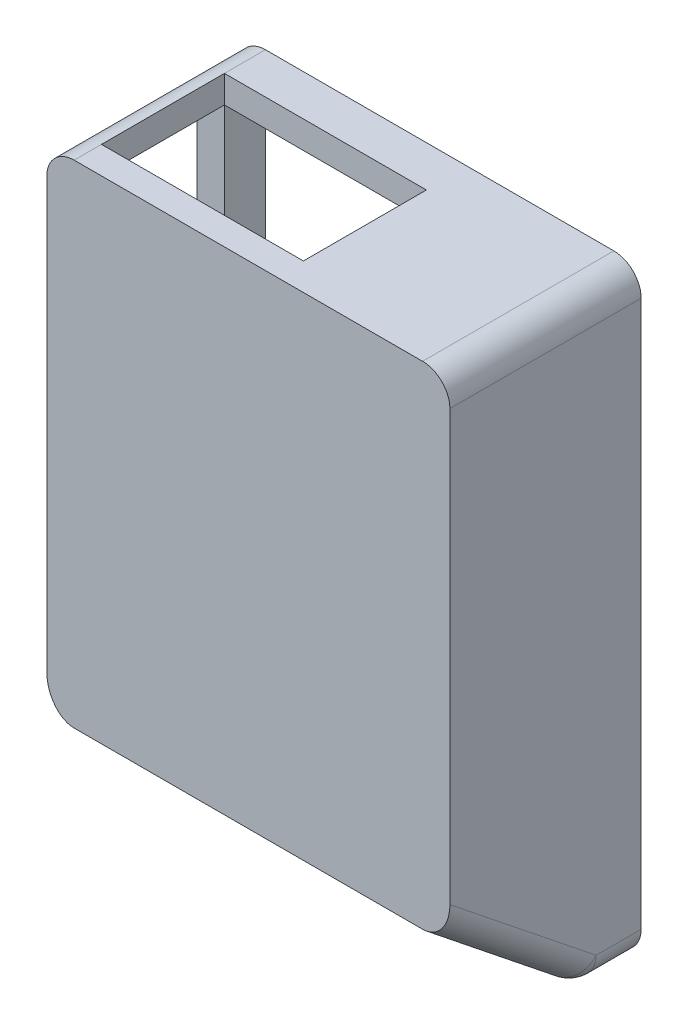
ISO-10303-21;
HEADER;
FILE_DESCRIPTION(('STEP AP214'),'2;1');
FILE_NAME('part.step','',(''),(''),'','','');
FILE_SCHEMA(('AUTOMOTIVE_DESIGN { 1 0 10303 214 1 1 1 1 }'));
ENDSEC;
DATA;
#1=APPLICATION_CONTEXT('core data for automotive mechanical design processes');
#2=APPLICATION_PROTOCOL_DEFINITION('international standard','automotive_design',2000,#1);
#3=PRODUCT_CONTEXT('',#1,'mechanical');
#4=PRODUCT('Part','Part','',(#3));
#5=PRODUCT_RELATED_PRODUCT_CATEGORY('part','',(#4));
#6=PRODUCT_DEFINITION_FORMATION('','',#4);
#7=PRODUCT_DEFINITION_CONTEXT('part definition',#1,'design');
#8=PRODUCT_DEFINITION('design','',#6,#7);
#9=PRODUCT_DEFINITION_SHAPE('','',#8);
#10=(LENGTH_UNIT() NAMED_UNIT(*) SI_UNIT(.MILLI.,.METRE.));
#11=(NAMED_UNIT(*) PLANE_ANGLE_UNIT() SI_UNIT($,.RADIAN.));
#12=(NAMED_UNIT(*) SI_UNIT($,.STERADIAN.) SOLID_ANGLE_UNIT());
#13=UNCERTAINTY_MEASURE_WITH_UNIT(LENGTH_MEASURE(1.E-05),#10,'distance_accuracy_value','');
#14=(GEOMETRIC_REPRESENTATION_CONTEXT(3) GLOBAL_UNCERTAINTY_ASSIGNED_CONTEXT((#13)) GLOBAL_UNIT_ASSIGNED_CONTEXT((#10,
#11,#12)) REPRESENTATION_CONTEXT('',''));
#15=CARTESIAN_POINT('',(0.,0.,0.));
#16=DIRECTION('',(0.,0.,1.));
#17=DIRECTION('',(1.,0.,0.));
#18=AXIS2_PLACEMENT_3D('',#15,#16,#17);
#19=CARTESIAN_POINT('',(-12.75,-20.,12.));
#20=DIRECTION('',(1.,0.,0.));
#21=DIRECTION('',(0.,0.,-1.));
#22=AXIS2_PLACEMENT_3D('',#19,#20,#21);
#23=PLANE('',#22);
#24=DIRECTION('',(0.,0.,-1.));
#25=VECTOR('',#24,1.);
#26=CARTESIAN_POINT('',(-12.75,20.,12.));
#27=LINE('',#26,#25);
#28=CARTESIAN_POINT('',(-12.75,20.,12.));
#29=VERTEX_POINT('',#28);
#30=CARTESIAN_POINT('',(-12.75,20.,3.));
#31=VERTEX_POINT('',#30);
#32=EDGE_CURVE('E256',#29,#31,#27,.T.);
#33=ORIENTED_EDGE('',*,*,#32,.T.);
#34=DIRECTION('',(0.,1.,0.));
#35=VECTOR('',#34,1.);
#36=CARTESIAN_POINT('',(-12.75,-22.001,3.));
#37=LINE('',#36,#35);
#38=CARTESIAN_POINT('',(-12.75,22.,3.));
#39=VERTEX_POINT('',#38);
#40=EDGE_CURVE('E268',#31,#39,#37,.T.);
#41=ORIENTED_EDGE('',*,*,#40,.T.);
#42=DIRECTION('',(0.,0.,1.));
#43=VECTOR('',#42,1.);
#44=CARTESIAN_POINT('',(-12.75,22.,3.));
#45=LINE('',#44,#43);
#46=CARTESIAN_POINT('',(-12.75,22.,12.));
#47=VERTEX_POINT('',#46);
#48=EDGE_CURVE('E905',#39,#47,#45,.T.);
#49=ORIENTED_EDGE('',*,*,#48,.T.);
#50=DIRECTION('',(0.,-1.,0.));
#51=VECTOR('',#50,1.);
#52=CARTESIAN_POINT('',(-12.75,-20.,12.));
#53=LINE('',#52,#51);
#54=EDGE_CURVE('E267',#47,#29,#53,.T.);
#55=ORIENTED_EDGE('',*,*,#54,.T.);
#56=EDGE_LOOP('',(#33,#41,#49,#55));
#57=FACE_BOUND('',#56,.T.);
#58=ADVANCED_FACE('F51',(#57),#23,.T.);
#59=CARTESIAN_POINT('',(12.75,-20.,12.));
#60=DIRECTION('',(-1.,0.,0.));
#61=DIRECTION('',(0.,0.,1.));
#62=AXIS2_PLACEMENT_3D('',#59,#60,#61);
#63=PLANE('',#62);
#64=DIRECTION('',(0.,0.,-1.));
#65=VECTOR('',#64,1.);
#66=CARTESIAN_POINT('',(12.75,-20.,12.));
#67=LINE('',#66,#65);
#68=CARTESIAN_POINT('',(12.75,-20.,2.));
#69=VERTEX_POINT('',#68);
#70=CARTESIAN_POINT('',(12.75,-20.,0.));
#71=VERTEX_POINT('',#70);
#72=EDGE_CURVE('E297',#69,#71,#67,.T.);
#73=ORIENTED_EDGE('',*,*,#72,.F.);
#74=DIRECTION('',(0.,0.624695047554424,0.78086880944303));
#75=VECTOR('',#74,1.);
#76=CARTESIAN_POINT('',(12.75,-15.1219512195122,8.09756097560976));
#77=LINE('',#76,#75);
#78=CARTESIAN_POINT('',(12.75,-12.,12.));
#79=VERTEX_POINT('',#78);
#80=EDGE_CURVE('E352',#69,#79,#77,.T.);
#81=ORIENTED_EDGE('',*,*,#80,.T.);
#82=DIRECTION('',(0.,1.,0.));
#83=VECTOR('',#82,1.);
#84=CARTESIAN_POINT('',(12.75,-20.,12.));
#85=LINE('',#84,#83);
#86=CARTESIAN_POINT('',(12.75,-4.05188691446148,12.));
#87=VERTEX_POINT('',#86);
#88=EDGE_CURVE('E303',#79,#87,#85,.T.);
#89=ORIENTED_EDGE('',*,*,#88,.T.);
#90=DIRECTION('',(0.,0.,1.));
#91=VECTOR('',#90,1.);
#92=CARTESIAN_POINT('',(12.7499999999967,-4.05188691446148,-26.3329647750023));
#93=LINE('',#92,#91);
#94=CARTESIAN_POINT('',(12.75,-4.05188691446147,1.6));
#95=VERTEX_POINT('',#94);
#96=EDGE_CURVE('E871',#95,#87,#93,.T.);
#97=ORIENTED_EDGE('',*,*,#96,.F.);
#98=DIRECTION('',(0.,-1.,0.));
#99=VECTOR('',#98,1.);
#100=CARTESIAN_POINT('',(12.7499999999967,4.68218043449235,1.6));
#101=LINE('',#100,#99);
#102=CARTESIAN_POINT('',(12.75,4.68218043449235,1.6));
#103=VERTEX_POINT('',#102);
#104=EDGE_CURVE('E826',#103,#95,#101,.T.);
#105=ORIENTED_EDGE('',*,*,#104,.F.);
#106=DIRECTION('',(0.,0.,1.));
#107=VECTOR('',#106,1.);
#108=CARTESIAN_POINT('',(12.7499999999967,4.68218043449235,-26.3329647750023));
#109=LINE('',#108,#107);
#110=CARTESIAN_POINT('',(12.75,4.68218043449235,12.));
#111=VERTEX_POINT('',#110);
#112=EDGE_CURVE('E875',#103,#111,#109,.T.);
#113=ORIENTED_EDGE('',*,*,#112,.T.);
#114=CARTESIAN_POINT('',(12.75,20.,12.));
#115=VERTEX_POINT('',#114);
#116=EDGE_CURVE('E832',#111,#115,#85,.T.);
#117=ORIENTED_EDGE('',*,*,#116,.T.);
#118=DIRECTION('',(0.,0.,-1.));
#119=VECTOR('',#118,1.);
#120=CARTESIAN_POINT('',(12.75,20.,12.));
#121=LINE('',#120,#119);
#122=CARTESIAN_POINT('',(12.75,20.,0.));
#123=VERTEX_POINT('',#122);
#124=EDGE_CURVE('E300',#115,#123,#121,.T.);
#125=ORIENTED_EDGE('',*,*,#124,.T.);
#126=DIRECTION('',(0.,1.,0.));
#127=VECTOR('',#126,1.);
#128=CARTESIAN_POINT('',(12.75,-20.,0.));
#129=LINE('',#128,#127);
#130=EDGE_CURVE('E836',#71,#123,#129,.T.);
#131=ORIENTED_EDGE('',*,*,#130,.F.);
#132=EDGE_LOOP('',(#73,#81,#89,#97,#105,#113,#117,#125,#131));
#133=FACE_BOUND('',#132,.T.);
#134=ADVANCED_FACE('F473',(#133),#63,.T.);
#135=CARTESIAN_POINT('',(12.75,20.,12.));
#136=DIRECTION('',(0.,-1.,0.));
#137=DIRECTION('',(1.,0.,0.));
#138=AXIS2_PLACEMENT_3D('',#135,#136,#137);
#139=PLANE('',#138);
#140=DIRECTION('',(-1.,0.,0.));
#141=VECTOR('',#140,1.);
#142=CARTESIAN_POINT('',(-12.75,20.,3.));
#143=LINE('',#142,#141);
#144=CARTESIAN_POINT('',(2.02937643160162,20.000000000005,3.));
#145=VERTEX_POINT('',#144);
#146=EDGE_CURVE('E273',#145,#31,#143,.T.);
#147=ORIENTED_EDGE('',*,*,#146,.T.);
#148=DIRECTION('',(0.,0.,-1.));
#149=VECTOR('',#148,1.);
#150=CARTESIAN_POINT('',(-12.75,20.,12.));
#151=LINE('',#150,#149);
#152=CARTESIAN_POINT('',(-12.75,20.,0.));
#153=VERTEX_POINT('',#152);
#154=EDGE_CURVE('E282',#31,#153,#151,.T.);
#155=ORIENTED_EDGE('',*,*,#154,.T.);
#156=DIRECTION('',(-1.,0.,0.));
#157=VECTOR('',#156,1.);
#158=CARTESIAN_POINT('',(12.75,20.,0.));
#159=LINE('',#158,#157);
#160=EDGE_CURVE('E306',#123,#153,#159,.T.);
#161=ORIENTED_EDGE('',*,*,#160,.F.);
#162=ORIENTED_EDGE('',*,*,#124,.F.);
#163=DIRECTION('',(-1.,0.,0.));
#164=VECTOR('',#163,1.);
#165=CARTESIAN_POINT('',(12.75,20.,12.));
#166=LINE('',#165,#164);
#167=CARTESIAN_POINT('',(4.02937643160162,20.,12.));
#168=VERTEX_POINT('',#167);
#169=EDGE_CURVE('E296',#115,#168,#166,.T.);
#170=ORIENTED_EDGE('',*,*,#169,.T.);
#171=DIRECTION('',(0.,0.,1.));
#172=VECTOR('',#171,1.);
#173=CARTESIAN_POINT('',(4.02937643160162,20.000000000005,-26.3329647750023));
#174=LINE('',#173,#172);
#175=CARTESIAN_POINT('',(4.02937643160162,20.,1.6));
#176=VERTEX_POINT('',#175);
#177=EDGE_CURVE('E857',#176,#168,#174,.T.);
#178=ORIENTED_EDGE('',*,*,#177,.F.);
#179=DIRECTION('',(1.,0.,0.));
#180=VECTOR('',#179,1.);
#181=CARTESIAN_POINT('',(2.02937643160162,20.000000000005,1.6));
#182=LINE('',#181,#180);
#183=CARTESIAN_POINT('',(2.02937643160162,20.,1.6));
#184=VERTEX_POINT('',#183);
#185=EDGE_CURVE('E892',#184,#176,#182,.T.);
#186=ORIENTED_EDGE('',*,*,#185,.F.);
#187=DIRECTION('',(0.,0.,1.));
#188=VECTOR('',#187,1.);
#189=CARTESIAN_POINT('',(2.02937643160162,20.000000000005,-26.3329647750023));
#190=LINE('',#189,#188);
#191=EDGE_CURVE('E290',#184,#145,#190,.T.);
#192=ORIENTED_EDGE('',*,*,#191,.T.);
#193=EDGE_LOOP('',(#147,#155,#161,#162,#170,#178,#186,#192));
#194=FACE_BOUND('',#193,.T.);
#195=ADVANCED_FACE('F281',(#194),#139,.T.);
#196=CARTESIAN_POINT('',(0.,0.,12.));
#197=DIRECTION('',(0.,0.,1.));
#198=DIRECTION('',(1.,0.,0.));
#199=AXIS2_PLACEMENT_3D('',#196,#197,#198);
#200=PLANE('',#199);
#201=DIRECTION('',(0.,-1.,0.));
#202=VECTOR('',#201,1.);
#203=CARTESIAN_POINT('',(4.02937643160162,20.000000000005,12.));
#204=LINE('',#203,#202);
#205=CARTESIAN_POINT('',(4.02937643160162,4.68218043449235,12.));
#206=VERTEX_POINT('',#205);
#207=EDGE_CURVE('E858',#168,#206,#204,.T.);
#208=ORIENTED_EDGE('',*,*,#207,.F.);
#209=ORIENTED_EDGE('',*,*,#169,.F.);
#210=ORIENTED_EDGE('',*,*,#116,.F.);
#211=DIRECTION('',(1.,0.,0.));
#212=VECTOR('',#211,1.);
#213=CARTESIAN_POINT('',(4.02937643160162,4.68218043449235,12.));
#214=LINE('',#213,#212);
#215=EDGE_CURVE('E872',#206,#111,#214,.T.);
#216=ORIENTED_EDGE('',*,*,#215,.F.);
#217=EDGE_LOOP('',(#208,#209,#210,#216));
#218=FACE_BOUND('',#217,.T.);
#219=ADVANCED_FACE('F712',(#218),#200,.F.);
#220=ORIENTED_EDGE('',*,*,#88,.F.);
#221=DIRECTION('',(-1.,0.,0.));
#222=VECTOR('',#221,1.);
#223=CARTESIAN_POINT('',(0.,-12.,12.));
#224=LINE('',#223,#222);
#225=CARTESIAN_POINT('',(-12.75,-12.,12.));
#226=VERTEX_POINT('',#225);
#227=EDGE_CURVE('E351',#79,#226,#224,.T.);
#228=ORIENTED_EDGE('',*,*,#227,.T.);
#229=CARTESIAN_POINT('',(-12.75,9.53218327183042,12.));
#230=VERTEX_POINT('',#229);
#231=EDGE_CURVE('E833',#230,#226,#53,.T.);
#232=ORIENTED_EDGE('',*,*,#231,.F.);
#233=DIRECTION('',(-1.,0.,0.));
#234=VECTOR('',#233,1.);
#235=CARTESIAN_POINT('',(14.751,9.53218327183042,12.));
#236=LINE('',#235,#234);
#237=CARTESIAN_POINT('',(-14.75,9.53218327183042,12.));
#238=VERTEX_POINT('',#237);
#239=EDGE_CURVE('E907',#230,#238,#236,.T.);
#240=ORIENTED_EDGE('',*,*,#239,.T.);
#241=DIRECTION('',(0.,1.,0.));
#242=VECTOR('',#241,1.);
#243=CARTESIAN_POINT('',(-14.75,20.,12.));
#244=LINE('',#243,#242);
#245=CARTESIAN_POINT('',(-14.75,20.,12.));
#246=VERTEX_POINT('',#245);
#247=EDGE_CURVE('E912',#238,#246,#244,.T.);
#248=ORIENTED_EDGE('',*,*,#247,.T.);
#249=DIRECTION('',(-1.,0.,0.));
#250=VECTOR('',#249,1.);
#251=CARTESIAN_POINT('',(14.751,20.,12.));
#252=LINE('',#251,#250);
#253=EDGE_CURVE('E286',#29,#246,#252,.T.);
#254=ORIENTED_EDGE('',*,*,#253,.F.);
#255=ORIENTED_EDGE('',*,*,#54,.F.);
#256=DIRECTION('',(1.,0.,0.));
#257=VECTOR('',#256,1.);
#258=CARTESIAN_POINT('',(-12.75,22.,12.));
#259=LINE('',#258,#257);
#260=CARTESIAN_POINT('',(2.02937643160162,22.,12.));
#261=VERTEX_POINT('',#260);
#262=EDGE_CURVE('E904',#47,#261,#259,.T.);
#263=ORIENTED_EDGE('',*,*,#262,.T.);
#264=DIRECTION('',(0.,1.,0.));
#265=VECTOR('',#264,1.);
#266=CARTESIAN_POINT('',(2.02937643160162,-4.05188691446148,12.));
#267=LINE('',#266,#265);
#268=CARTESIAN_POINT('',(2.02937643160162,0.948113085538524,12.));
#269=VERTEX_POINT('',#268);
#270=EDGE_CURVE('E879',#269,#261,#267,.T.);
#271=ORIENTED_EDGE('',*,*,#270,.F.);
#272=CARTESIAN_POINT('',(7.02937643160162,0.948113085538524,12.));
#273=DIRECTION('',(0.,0.,1.));
#274=DIRECTION('',(1.,0.,0.));
#275=AXIS2_PLACEMENT_3D('',#272,#273,#274);
#276=CIRCLE('',#275,5.);
#277=CARTESIAN_POINT('',(7.02937643160162,-4.05188691446148,12.));
#278=VERTEX_POINT('',#277);
#279=EDGE_CURVE('E366',#269,#278,#276,.T.);
#280=ORIENTED_EDGE('',*,*,#279,.T.);
#281=DIRECTION('',(-1.,0.,0.));
#282=VECTOR('',#281,1.);
#283=CARTESIAN_POINT('',(12.7499999999967,-4.05188691446148,12.));
#284=LINE('',#283,#282);
#285=EDGE_CURVE('E877',#87,#278,#284,.T.);
#286=ORIENTED_EDGE('',*,*,#285,.F.);
#287=EDGE_LOOP('',(#220,#228,#232,#240,#248,#254,#255,#263,#271,#280,#286));
#288=FACE_BOUND('',#287,.T.);
#289=ADVANCED_FACE('F725',(#288),#200,.F.);
#290=CARTESIAN_POINT('',(0.,0.,0.));
#291=DIRECTION('',(0.,0.,-1.));
#292=DIRECTION('',(-1.,0.,0.));
#293=AXIS2_PLACEMENT_3D('',#290,#291,#292);
#294=PLANE('',#293);
#295=DIRECTION('',(0.,1.,0.));
#296=VECTOR('',#295,1.);
#297=CARTESIAN_POINT('',(14.75,-22.,0.));
#298=LINE('',#297,#296);
#299=CARTESIAN_POINT('',(14.75,-20.,0.));
#300=VERTEX_POINT('',#299);
#301=CARTESIAN_POINT('',(14.75,20.,0.));
#302=VERTEX_POINT('',#301);
#303=EDGE_CURVE('E313',#300,#302,#298,.T.);
#304=ORIENTED_EDGE('',*,*,#303,.F.);
#305=CARTESIAN_POINT('',(12.75,-20.,0.));
#306=DIRECTION('',(0.,0.,-1.));
#307=DIRECTION('',(-1.,0.,0.));
#308=AXIS2_PLACEMENT_3D('',#305,#306,#307);
#309=CIRCLE('',#308,2.);
#310=CARTESIAN_POINT('',(12.75,-22.,0.));
#311=VERTEX_POINT('',#310);
#312=EDGE_CURVE('E66',#300,#311,#309,.T.);
#313=ORIENTED_EDGE('',*,*,#312,.T.);
#314=DIRECTION('',(1.,0.,0.));
#315=VECTOR('',#314,1.);
#316=CARTESIAN_POINT('',(14.75,-22.,0.));
#317=LINE('',#316,#315);
#318=CARTESIAN_POINT('',(-12.75,-22.,0.));
#319=VERTEX_POINT('',#318);
#320=EDGE_CURVE('E315',#319,#311,#317,.T.);
#321=ORIENTED_EDGE('',*,*,#320,.F.);
#322=CARTESIAN_POINT('',(-12.75,-20.,0.));
#323=DIRECTION('',(0.,0.,-1.));
#324=DIRECTION('',(-1.,0.,0.));
#325=AXIS2_PLACEMENT_3D('',#322,#323,#324);
#326=CIRCLE('',#325,2.);
#327=CARTESIAN_POINT('',(-14.75,-20.,0.));
#328=VERTEX_POINT('',#327);
#329=EDGE_CURVE('E392',#319,#328,#326,.T.);
#330=ORIENTED_EDGE('',*,*,#329,.T.);
#331=DIRECTION('',(0.,-1.,0.));
#332=VECTOR('',#331,1.);
#333=CARTESIAN_POINT('',(-14.75,-22.,0.));
#334=LINE('',#333,#332);
#335=CARTESIAN_POINT('',(-14.75,20.,0.));
#336=VERTEX_POINT('',#335);
#337=EDGE_CURVE('E316',#336,#328,#334,.T.);
#338=ORIENTED_EDGE('',*,*,#337,.F.);
#339=CARTESIAN_POINT('',(-12.75,20.,0.));
#340=DIRECTION('',(0.,0.,-1.));
#341=DIRECTION('',(-1.,0.,0.));
#342=AXIS2_PLACEMENT_3D('',#339,#340,#341);
#343=CIRCLE('',#342,2.);
#344=CARTESIAN_POINT('',(-12.75,22.,0.));
#345=VERTEX_POINT('',#344);
#346=EDGE_CURVE('E329',#336,#345,#343,.T.);
#347=ORIENTED_EDGE('',*,*,#346,.T.);
#348=DIRECTION('',(-1.,0.,0.));
#349=VECTOR('',#348,1.);
#350=CARTESIAN_POINT('',(14.75,22.,0.));
#351=LINE('',#350,#349);
#352=CARTESIAN_POINT('',(12.75,22.,0.));
#353=VERTEX_POINT('',#352);
#354=EDGE_CURVE('E317',#353,#345,#351,.T.);
#355=ORIENTED_EDGE('',*,*,#354,.F.);
#356=CARTESIAN_POINT('',(12.75,20.,0.));
#357=DIRECTION('',(0.,0.,-1.));
#358=DIRECTION('',(-1.,0.,0.));
#359=AXIS2_PLACEMENT_3D('',#356,#357,#358);
#360=CIRCLE('',#359,2.);
#361=EDGE_CURVE('E333',#353,#302,#360,.T.);
#362=ORIENTED_EDGE('',*,*,#361,.T.);
#363=EDGE_LOOP('',(#304,#313,#321,#330,#338,#347,#355,#362));
#364=FACE_BOUND('',#363,.T.);
#365=ORIENTED_EDGE('',*,*,#160,.T.);
#366=DIRECTION('',(0.,-1.,0.));
#367=VECTOR('',#366,1.);
#368=CARTESIAN_POINT('',(-12.75,-20.,0.));
#369=LINE('',#368,#367);
#370=CARTESIAN_POINT('',(-12.75,-20.,0.));
#371=VERTEX_POINT('',#370);
#372=EDGE_CURVE('E294',#153,#371,#369,.T.);
#373=ORIENTED_EDGE('',*,*,#372,.T.);
#374=DIRECTION('',(1.,0.,0.));
#375=VECTOR('',#374,1.);
#376=CARTESIAN_POINT('',(12.75,-20.,0.));
#377=LINE('',#376,#375);
#378=EDGE_CURVE('E840',#371,#71,#377,.T.);
#379=ORIENTED_EDGE('',*,*,#378,.T.);
#380=ORIENTED_EDGE('',*,*,#130,.T.);
#381=EDGE_LOOP('',(#365,#373,#379,#380));
#382=FACE_BOUND('',#381,.T.);
#383=ADVANCED_FACE('F420',(#364,#382),#294,.T.);
#384=CARTESIAN_POINT('',(14.75,-22.,12.));
#385=DIRECTION('',(0.,1.,0.));
#386=DIRECTION('',(-1.,0.,0.));
#387=AXIS2_PLACEMENT_3D('',#384,#385,#386);
#388=PLANE('',#387);
#389=ORIENTED_EDGE('',*,*,#320,.T.);
#390=DIRECTION('',(0.,0.,-1.));
#391=VECTOR('',#390,1.);
#392=CARTESIAN_POINT('',(12.75,-22.,12.));
#393=LINE('',#392,#391);
#394=CARTESIAN_POINT('',(12.75,-22.,3.29843788128358));
#395=VERTEX_POINT('',#394);
#396=EDGE_CURVE('E14',#311,#395,#393,.F.);
#397=ORIENTED_EDGE('',*,*,#396,.T.);
#398=DIRECTION('',(-1.,0.,0.));
#399=VECTOR('',#398,1.);
#400=CARTESIAN_POINT('',(-14.75,-22.,3.29843788128358));
#401=LINE('',#400,#399);
#402=CARTESIAN_POINT('',(-12.75,-22.,3.29843788128358));
#403=VERTEX_POINT('',#402);
#404=EDGE_CURVE('E368',#395,#403,#401,.T.);
#405=ORIENTED_EDGE('',*,*,#404,.T.);
#406=DIRECTION('',(0.,0.,-1.));
#407=VECTOR('',#406,1.);
#408=CARTESIAN_POINT('',(-12.75,-22.,12.));
#409=LINE('',#408,#407);
#410=EDGE_CURVE('E58',#403,#319,#409,.T.);
#411=ORIENTED_EDGE('',*,*,#410,.T.);
#412=EDGE_LOOP('',(#389,#397,#405,#411));
#413=FACE_BOUND('',#412,.T.);
#414=ADVANCED_FACE('F448',(#413),#388,.F.);
#415=CARTESIAN_POINT('',(14.75,-22.,12.));
#416=DIRECTION('',(-1.,0.,0.));
#417=DIRECTION('',(0.,0.,1.));
#418=AXIS2_PLACEMENT_3D('',#415,#416,#417);
#419=PLANE('',#418);
#420=DIRECTION('',(0.,1.,0.));
#421=VECTOR('',#420,1.);
#422=CARTESIAN_POINT('',(14.75,0.,14.));
#423=LINE('',#422,#421);
#424=CARTESIAN_POINT('',(14.75,-11.4387503050269,14.));
#425=VERTEX_POINT('',#424);
#426=CARTESIAN_POINT('',(14.75,20.,14.));
#427=VERTEX_POINT('',#426);
#428=EDGE_CURVE('E823',#425,#427,#423,.T.);
#429=ORIENTED_EDGE('',*,*,#428,.F.);
#430=DIRECTION('',(0.,-0.624695047554424,-0.78086880944303));
#431=VECTOR('',#430,1.);
#432=CARTESIAN_POINT('',(14.75,-20.,3.29843788128358));
#433=LINE('',#432,#431);
#434=CARTESIAN_POINT('',(14.75,-20.,3.29843788128358));
#435=VERTEX_POINT('',#434);
#436=EDGE_CURVE('E374',#425,#435,#433,.T.);
#437=ORIENTED_EDGE('',*,*,#436,.T.);
#438=DIRECTION('',(0.,0.,-1.));
#439=VECTOR('',#438,1.);
#440=CARTESIAN_POINT('',(14.75,-20.,12.));
#441=LINE('',#440,#439);
#442=EDGE_CURVE('E373',#435,#300,#441,.T.);
#443=ORIENTED_EDGE('',*,*,#442,.T.);
#444=ORIENTED_EDGE('',*,*,#303,.T.);
#445=DIRECTION('',(0.,0.,-1.));
#446=VECTOR('',#445,1.);
#447=CARTESIAN_POINT('',(14.75,20.,12.));
#448=LINE('',#447,#446);
#449=EDGE_CURVE('E335',#302,#427,#448,.F.);
#450=ORIENTED_EDGE('',*,*,#449,.T.);
#451=EDGE_LOOP('',(#429,#437,#443,#444,#450));
#452=FACE_BOUND('',#451,.T.);
#453=ADVANCED_FACE('F498',(#452),#419,.F.);
#454=CARTESIAN_POINT('',(14.75,22.,12.));
#455=DIRECTION('',(0.,-1.,0.));
#456=DIRECTION('',(1.,0.,0.));
#457=AXIS2_PLACEMENT_3D('',#454,#455,#456);
#458=PLANE('',#457);
#459=DIRECTION('',(-1.,0.,0.));
#460=VECTOR('',#459,1.);
#461=CARTESIAN_POINT('',(0.,22.,14.));
#462=LINE('',#461,#460);
#463=CARTESIAN_POINT('',(12.75,22.,14.));
#464=VERTEX_POINT('',#463);
#465=CARTESIAN_POINT('',(-12.75,22.,14.));
#466=VERTEX_POINT('',#465);
#467=EDGE_CURVE('E440',#464,#466,#462,.T.);
#468=ORIENTED_EDGE('',*,*,#467,.F.);
#469=DIRECTION('',(0.,0.,-1.));
#470=VECTOR('',#469,1.);
#471=CARTESIAN_POINT('',(12.75,22.,12.));
#472=LINE('',#471,#470);
#473=EDGE_CURVE('E328',#464,#353,#472,.T.);
#474=ORIENTED_EDGE('',*,*,#473,.T.);
#475=ORIENTED_EDGE('',*,*,#354,.T.);
#476=DIRECTION('',(0.,0.,-1.));
#477=VECTOR('',#476,1.);
#478=CARTESIAN_POINT('',(-12.75,22.,12.));
#479=LINE('',#478,#477);
#480=EDGE_CURVE('E323',#345,#39,#479,.F.);
#481=ORIENTED_EDGE('',*,*,#480,.T.);
#482=DIRECTION('',(-1.,0.,0.));
#483=VECTOR('',#482,1.);
#484=CARTESIAN_POINT('',(-12.75,22.,3.));
#485=LINE('',#484,#483);
#486=CARTESIAN_POINT('',(2.02937643160162,22.,3.));
#487=VERTEX_POINT('',#486);
#488=EDGE_CURVE('E280',#487,#39,#485,.T.);
#489=ORIENTED_EDGE('',*,*,#488,.F.);
#490=DIRECTION('',(0.,0.,-1.));
#491=VECTOR('',#490,1.);
#492=CARTESIAN_POINT('',(2.02937643160162,22.,3.));
#493=LINE('',#492,#491);
#494=EDGE_CURVE('E902',#261,#487,#493,.T.);
#495=ORIENTED_EDGE('',*,*,#494,.F.);
#496=ORIENTED_EDGE('',*,*,#262,.F.);
#497=DIRECTION('',(0.,0.,-1.));
#498=VECTOR('',#497,1.);
#499=CARTESIAN_POINT('',(-12.75,22.,12.));
#500=LINE('',#499,#498);
#501=EDGE_CURVE('E321',#47,#466,#500,.F.);
#502=ORIENTED_EDGE('',*,*,#501,.T.);
#503=EDGE_LOOP('',(#468,#474,#475,#481,#489,#495,#496,#502));
#504=FACE_BOUND('',#503,.T.);
#505=ADVANCED_FACE('F432',(#504),#458,.F.);
#506=CARTESIAN_POINT('',(-14.75,-22.,12.));
#507=DIRECTION('',(1.,0.,0.));
#508=DIRECTION('',(0.,1.,0.));
#509=AXIS2_PLACEMENT_3D('',#506,#507,#508);
#510=PLANE('',#509);
#511=DIRECTION('',(0.,0.,-1.));
#512=VECTOR('',#511,1.);
#513=CARTESIAN_POINT('',(-14.75,-20.,12.));
#514=LINE('',#513,#512);
#515=CARTESIAN_POINT('',(-14.75,-20.,3.29843788128358));
#516=VERTEX_POINT('',#515);
#517=EDGE_CURVE('E387',#328,#516,#514,.F.);
#518=ORIENTED_EDGE('',*,*,#517,.T.);
#519=DIRECTION('',(0.,0.624695047554424,0.78086880944303));
#520=VECTOR('',#519,1.);
#521=CARTESIAN_POINT('',(-14.75,-12.4382623811139,12.7506099048912));
#522=LINE('',#521,#520);
#523=CARTESIAN_POINT('',(-14.75,-11.4387503050269,14.));
#524=VERTEX_POINT('',#523);
#525=EDGE_CURVE('E395',#516,#524,#522,.T.);
#526=ORIENTED_EDGE('',*,*,#525,.T.);
#527=DIRECTION('',(0.,1.,0.));
#528=VECTOR('',#527,1.);
#529=CARTESIAN_POINT('',(-14.75,0.,14.));
#530=LINE('',#529,#528);
#531=CARTESIAN_POINT('',(-14.75,20.,14.));
#532=VERTEX_POINT('',#531);
#533=EDGE_CURVE('E819',#524,#532,#530,.T.);
#534=ORIENTED_EDGE('',*,*,#533,.T.);
#535=DIRECTION('',(0.,0.,-1.));
#536=VECTOR('',#535,1.);
#537=CARTESIAN_POINT('',(-14.75,20.,12.));
#538=LINE('',#537,#536);
#539=EDGE_CURVE('E343',#532,#246,#538,.T.);
#540=ORIENTED_EDGE('',*,*,#539,.T.);
#541=ORIENTED_EDGE('',*,*,#247,.F.);
#542=DIRECTION('',(0.,0.,1.));
#543=VECTOR('',#542,1.);
#544=CARTESIAN_POINT('',(-14.75,9.53218327183042,12.));
#545=LINE('',#544,#543);
#546=CARTESIAN_POINT('',(-14.75,9.53218327183042,3.));
#547=VERTEX_POINT('',#546);
#548=EDGE_CURVE('E270',#547,#238,#545,.T.);
#549=ORIENTED_EDGE('',*,*,#548,.F.);
#550=DIRECTION('',(0.,-1.,0.));
#551=VECTOR('',#550,1.);
#552=CARTESIAN_POINT('',(-14.75,20.,3.));
#553=LINE('',#552,#551);
#554=CARTESIAN_POINT('',(-14.75,20.,3.));
#555=VERTEX_POINT('',#554);
#556=EDGE_CURVE('E428',#555,#547,#553,.T.);
#557=ORIENTED_EDGE('',*,*,#556,.F.);
#558=DIRECTION('',(0.,0.,-1.));
#559=VECTOR('',#558,1.);
#560=CARTESIAN_POINT('',(-14.75,20.,12.));
#561=LINE('',#560,#559);
#562=EDGE_CURVE('E341',#555,#336,#561,.T.);
#563=ORIENTED_EDGE('',*,*,#562,.T.);
#564=ORIENTED_EDGE('',*,*,#337,.T.);
#565=EDGE_LOOP('',(#518,#526,#534,#540,#541,#549,#557,#563,#564));
#566=FACE_BOUND('',#565,.T.);
#567=ADVANCED_FACE('F421',(#566),#510,.F.);
#568=ORIENTED_EDGE('',*,*,#231,.T.);
#569=DIRECTION('',(0.,-0.624695047554424,-0.78086880944303));
#570=VECTOR('',#569,1.);
#571=CARTESIAN_POINT('',(-12.75,-15.1219512195122,8.09756097560976));
#572=LINE('',#571,#570);
#573=CARTESIAN_POINT('',(-12.75,-20.,2.));
#574=VERTEX_POINT('',#573);
#575=EDGE_CURVE('E357',#226,#574,#572,.T.);
#576=ORIENTED_EDGE('',*,*,#575,.T.);
#577=DIRECTION('',(0.,0.,-1.));
#578=VECTOR('',#577,1.);
#579=CARTESIAN_POINT('',(-12.75,-20.,12.));
#580=LINE('',#579,#578);
#581=EDGE_CURVE('E309',#574,#371,#580,.T.);
#582=ORIENTED_EDGE('',*,*,#581,.T.);
#583=ORIENTED_EDGE('',*,*,#372,.F.);
#584=ORIENTED_EDGE('',*,*,#154,.F.);
#585=DIRECTION('',(0.,-1.,0.));
#586=VECTOR('',#585,1.);
#587=CARTESIAN_POINT('',(-12.75,20.,3.));
#588=LINE('',#587,#586);
#589=CARTESIAN_POINT('',(-12.75,9.53218327183042,3.));
#590=VERTEX_POINT('',#589);
#591=EDGE_CURVE('E241',#31,#590,#588,.T.);
#592=ORIENTED_EDGE('',*,*,#591,.T.);
#593=DIRECTION('',(0.,0.,1.));
#594=VECTOR('',#593,1.);
#595=CARTESIAN_POINT('',(-12.75,9.53218327183042,12.));
#596=LINE('',#595,#594);
#597=EDGE_CURVE('E842',#590,#230,#596,.T.);
#598=ORIENTED_EDGE('',*,*,#597,.T.);
#599=EDGE_LOOP('',(#568,#576,#582,#583,#584,#592,#598));
#600=FACE_BOUND('',#599,.T.);
#601=ADVANCED_FACE('F291',(#600),#23,.T.);
#602=CARTESIAN_POINT('',(12.75,-20.,12.));
#603=DIRECTION('',(0.,1.,0.));
#604=DIRECTION('',(-1.,0.,0.));
#605=AXIS2_PLACEMENT_3D('',#602,#603,#604);
#606=PLANE('',#605);
#607=ORIENTED_EDGE('',*,*,#581,.F.);
#608=DIRECTION('',(1.,0.,0.));
#609=VECTOR('',#608,1.);
#610=CARTESIAN_POINT('',(12.75,-20.,2.));
#611=LINE('',#610,#609);
#612=EDGE_CURVE('E347',#574,#69,#611,.T.);
#613=ORIENTED_EDGE('',*,*,#612,.T.);
#614=ORIENTED_EDGE('',*,*,#72,.T.);
#615=ORIENTED_EDGE('',*,*,#378,.F.);
#616=EDGE_LOOP('',(#607,#613,#614,#615));
#617=FACE_BOUND('',#616,.T.);
#618=ADVANCED_FACE('F488',(#617),#606,.T.);
#619=CARTESIAN_POINT('',(0.,0.,14.));
#620=DIRECTION('',(0.,0.,1.));
#621=DIRECTION('',(1.,0.,0.));
#622=AXIS2_PLACEMENT_3D('',#619,#620,#621);
#623=PLANE('',#622);
#624=DIRECTION('',(1.,0.,0.));
#625=VECTOR('',#624,1.);
#626=CARTESIAN_POINT('',(14.75,-14.,14.));
#627=LINE('',#626,#625);
#628=CARTESIAN_POINT('',(-12.75,-14.,14.));
#629=VERTEX_POINT('',#628);
#630=CARTESIAN_POINT('',(12.75,-14.,14.));
#631=VERTEX_POINT('',#630);
#632=EDGE_CURVE('E350',#629,#631,#627,.T.);
#633=ORIENTED_EDGE('',*,*,#632,.T.);
#634=CARTESIAN_POINT('',(12.75,-11.4387503050269,14.));
#635=DIRECTION('',(0.,0.,1.));
#636=DIRECTION('',(0.,1.,0.));
#637=AXIS2_PLACEMENT_3D('',#634,#635,#636);
#638=ELLIPSE('',#637,2.56124969497314,2.);
#639=EDGE_CURVE('E381',#631,#425,#638,.T.);
#640=ORIENTED_EDGE('',*,*,#639,.T.);
#641=ORIENTED_EDGE('',*,*,#428,.T.);
#642=CARTESIAN_POINT('',(12.75,20.,14.));
#643=DIRECTION('',(0.,0.,1.));
#644=DIRECTION('',(1.,0.,0.));
#645=AXIS2_PLACEMENT_3D('',#642,#643,#644);
#646=CIRCLE('',#645,2.);
#647=EDGE_CURVE('E338',#427,#464,#646,.T.);
#648=ORIENTED_EDGE('',*,*,#647,.T.);
#649=ORIENTED_EDGE('',*,*,#467,.T.);
#650=CARTESIAN_POINT('',(-12.75,20.,14.));
#651=DIRECTION('',(0.,0.,1.));
#652=DIRECTION('',(1.,0.,0.));
#653=AXIS2_PLACEMENT_3D('',#650,#651,#652);
#654=CIRCLE('',#653,2.);
#655=EDGE_CURVE('E340',#466,#532,#654,.T.);
#656=ORIENTED_EDGE('',*,*,#655,.T.);
#657=ORIENTED_EDGE('',*,*,#533,.F.);
#658=CARTESIAN_POINT('',(-12.75,-11.4387503050269,14.));
#659=DIRECTION('',(0.,0.,1.));
#660=DIRECTION('',(0.,-1.,0.));
#661=AXIS2_PLACEMENT_3D('',#658,#659,#660);
#662=ELLIPSE('',#661,2.56124969497314,2.);
#663=EDGE_CURVE('E385',#524,#629,#662,.T.);
#664=ORIENTED_EDGE('',*,*,#663,.T.);
#665=EDGE_LOOP('',(#633,#640,#641,#648,#649,#656,#657,#664));
#666=FACE_BOUND('',#665,.T.);
#667=ADVANCED_FACE('F489',(#666),#623,.T.);
#668=CARTESIAN_POINT('',(4.02937643160162,20.000000000005,-26.3329647750023));
#669=DIRECTION('',(-1.,0.,0.));
#670=DIRECTION('',(0.,-1.,0.));
#671=AXIS2_PLACEMENT_3D('',#668,#669,#670);
#672=PLANE('',#671);
#673=DIRECTION('',(0.,-1.,0.));
#674=VECTOR('',#673,1.);
#675=CARTESIAN_POINT('',(4.02937643160162,20.000000000005,1.6));
#676=LINE('',#675,#674);
#677=CARTESIAN_POINT('',(4.02937643160162,4.68218043449235,1.6));
#678=VERTEX_POINT('',#677);
#679=EDGE_CURVE('E861',#176,#678,#676,.T.);
#680=ORIENTED_EDGE('',*,*,#679,.F.);
#681=ORIENTED_EDGE('',*,*,#177,.T.);
#682=ORIENTED_EDGE('',*,*,#207,.T.);
#683=DIRECTION('',(0.,0.,1.));
#684=VECTOR('',#683,1.);
#685=CARTESIAN_POINT('',(4.02937643160162,4.68218043449235,-26.3329647750023));
#686=LINE('',#685,#684);
#687=EDGE_CURVE('E862',#678,#206,#686,.T.);
#688=ORIENTED_EDGE('',*,*,#687,.F.);
#689=EDGE_LOOP('',(#680,#681,#682,#688));
#690=FACE_BOUND('',#689,.T.);
#691=ADVANCED_FACE('F695',(#690),#672,.F.);
#692=CARTESIAN_POINT('',(4.02937643160162,4.68218043449235,-26.3329647750023));
#693=DIRECTION('',(0.,-1.,0.));
#694=DIRECTION('',(1.,0.,0.));
#695=AXIS2_PLACEMENT_3D('',#692,#693,#694);
#696=PLANE('',#695);
#697=DIRECTION('',(1.,0.,0.));
#698=VECTOR('',#697,1.);
#699=CARTESIAN_POINT('',(4.02937643160162,4.68218043449235,1.6));
#700=LINE('',#699,#698);
#701=EDGE_CURVE('E891',#678,#103,#700,.T.);
#702=ORIENTED_EDGE('',*,*,#701,.F.);
#703=ORIENTED_EDGE('',*,*,#687,.T.);
#704=ORIENTED_EDGE('',*,*,#215,.T.);
#705=ORIENTED_EDGE('',*,*,#112,.F.);
#706=EDGE_LOOP('',(#702,#703,#704,#705));
#707=FACE_BOUND('',#706,.T.);
#708=ADVANCED_FACE('F681',(#707),#696,.F.);
#709=CARTESIAN_POINT('',(12.7499999999967,-4.05188691446148,-26.3329647750023));
#710=DIRECTION('',(0.,1.,0.));
#711=DIRECTION('',(0.,0.,1.));
#712=AXIS2_PLACEMENT_3D('',#709,#710,#711);
#713=PLANE('',#712);
#714=ORIENTED_EDGE('',*,*,#285,.T.);
#715=DIRECTION('',(0.,0.,1.));
#716=VECTOR('',#715,1.);
#717=CARTESIAN_POINT('',(7.02937643160162,-4.05188691446148,-26.3329647750023));
#718=LINE('',#717,#716);
#719=CARTESIAN_POINT('',(7.02937643160162,-4.05188691446148,1.6));
#720=VERTEX_POINT('',#719);
#721=EDGE_CURVE('E365',#278,#720,#718,.F.);
#722=ORIENTED_EDGE('',*,*,#721,.T.);
#723=DIRECTION('',(-1.,0.,0.));
#724=VECTOR('',#723,1.);
#725=CARTESIAN_POINT('',(12.7499999999967,-4.05188691446148,1.6));
#726=LINE('',#725,#724);
#727=EDGE_CURVE('E821',#95,#720,#726,.T.);
#728=ORIENTED_EDGE('',*,*,#727,.F.);
#729=ORIENTED_EDGE('',*,*,#96,.T.);
#730=EDGE_LOOP('',(#714,#722,#728,#729));
#731=FACE_BOUND('',#730,.T.);
#732=ADVANCED_FACE('F674',(#731),#713,.F.);
#733=CARTESIAN_POINT('',(2.02937643160162,-4.05188691446148,-26.3329647750023));
#734=DIRECTION('',(1.,0.,0.));
#735=DIRECTION('',(0.,0.,-1.));
#736=AXIS2_PLACEMENT_3D('',#733,#734,#735);
#737=PLANE('',#736);
#738=DIRECTION('',(0.,1.,0.));
#739=VECTOR('',#738,1.);
#740=CARTESIAN_POINT('',(2.02937643160162,-4.05188691446148,1.6));
#741=LINE('',#740,#739);
#742=CARTESIAN_POINT('',(2.02937643160162,0.948113085538524,1.6));
#743=VERTEX_POINT('',#742);
#744=EDGE_CURVE('E869',#743,#184,#741,.T.);
#745=ORIENTED_EDGE('',*,*,#744,.F.);
#746=DIRECTION('',(0.,0.,1.));
#747=VECTOR('',#746,1.);
#748=CARTESIAN_POINT('',(2.02937643160162,0.948113085538524,-26.3329647750023));
#749=LINE('',#748,#747);
#750=EDGE_CURVE('E360',#743,#269,#749,.T.);
#751=ORIENTED_EDGE('',*,*,#750,.T.);
#752=ORIENTED_EDGE('',*,*,#270,.T.);
#753=ORIENTED_EDGE('',*,*,#494,.T.);
#754=DIRECTION('',(0.,1.,0.));
#755=VECTOR('',#754,1.);
#756=CARTESIAN_POINT('',(2.02937643160162,-22.001,3.));
#757=LINE('',#756,#755);
#758=EDGE_CURVE('E277',#145,#487,#757,.T.);
#759=ORIENTED_EDGE('',*,*,#758,.F.);
#760=ORIENTED_EDGE('',*,*,#191,.F.);
#761=EDGE_LOOP('',(#745,#751,#752,#753,#759,#760));
#762=FACE_BOUND('',#761,.T.);
#763=ADVANCED_FACE('F664',(#762),#737,.F.);
#764=CARTESIAN_POINT('',(0.,0.,1.6));
#765=DIRECTION('',(0.,0.,-1.));
#766=DIRECTION('',(-1.,0.,0.));
#767=AXIS2_PLACEMENT_3D('',#764,#765,#766);
#768=PLANE('',#767);
#769=CARTESIAN_POINT('',(7.76355720012289,0.,1.6));
#770=DIRECTION('',(0.,0.,-1.));
#771=DIRECTION('',(-1.,0.,0.));
#772=AXIS2_PLACEMENT_3D('',#769,#770,#771);
#773=CIRCLE('',#772,2.);
#774=CARTESIAN_POINT('',(5.76355720012289,0.,1.6));
#775=VERTEX_POINT('',#774);
#776=EDGE_CURVE('E401',#775,#775,#773,.T.);
#777=ORIENTED_EDGE('',*,*,#776,.F.);
#778=EDGE_LOOP('',(#777));
#779=FACE_BOUND('',#778,.T.);
#780=ORIENTED_EDGE('',*,*,#727,.T.);
#781=CARTESIAN_POINT('',(7.02937643160162,0.948113085538524,1.6));
#782=DIRECTION('',(0.,0.,-1.));
#783=DIRECTION('',(-1.,0.,0.));
#784=AXIS2_PLACEMENT_3D('',#781,#782,#783);
#785=CIRCLE('',#784,5.);
#786=EDGE_CURVE('E364',#720,#743,#785,.T.);
#787=ORIENTED_EDGE('',*,*,#786,.T.);
#788=ORIENTED_EDGE('',*,*,#744,.T.);
#789=ORIENTED_EDGE('',*,*,#185,.T.);
#790=ORIENTED_EDGE('',*,*,#679,.T.);
#791=ORIENTED_EDGE('',*,*,#701,.T.);
#792=ORIENTED_EDGE('',*,*,#104,.T.);
#793=EDGE_LOOP('',(#780,#787,#788,#789,#790,#791,#792));
#794=FACE_BOUND('',#793,.T.);
#795=ADVANCED_FACE('F652',(#779,#794),#768,.T.);
#796=CARTESIAN_POINT('',(-12.75,-22.001,3.));
#797=DIRECTION('',(0.,0.,-1.));
#798=DIRECTION('',(-1.,0.,0.));
#799=AXIS2_PLACEMENT_3D('',#796,#797,#798);
#800=PLANE('',#799);
#801=ORIENTED_EDGE('',*,*,#758,.T.);
#802=ORIENTED_EDGE('',*,*,#488,.T.);
#803=ORIENTED_EDGE('',*,*,#40,.F.);
#804=ORIENTED_EDGE('',*,*,#146,.F.);
#805=EDGE_LOOP('',(#801,#802,#803,#804));
#806=FACE_BOUND('',#805,.T.);
#807=ADVANCED_FACE('F274',(#806),#800,.F.);
#808=CARTESIAN_POINT('',(14.751,20.,12.));
#809=DIRECTION('',(0.,1.,0.));
#810=DIRECTION('',(-1.,0.,0.));
#811=AXIS2_PLACEMENT_3D('',#808,#809,#810);
#812=PLANE('',#811);
#813=ORIENTED_EDGE('',*,*,#253,.T.);
#814=DIRECTION('',(0.,0.,-1.));
#815=VECTOR('',#814,1.);
#816=CARTESIAN_POINT('',(-14.75,20.,12.));
#817=LINE('',#816,#815);
#818=EDGE_CURVE('E258',#246,#555,#817,.T.);
#819=ORIENTED_EDGE('',*,*,#818,.T.);
#820=DIRECTION('',(-1.,0.,0.));
#821=VECTOR('',#820,1.);
#822=CARTESIAN_POINT('',(14.751,20.,3.));
#823=LINE('',#822,#821);
#824=EDGE_CURVE('E244',#31,#555,#823,.T.);
#825=ORIENTED_EDGE('',*,*,#824,.F.);
#826=ORIENTED_EDGE('',*,*,#32,.F.);
#827=EDGE_LOOP('',(#813,#819,#825,#826));
#828=FACE_BOUND('',#827,.T.);
#829=ADVANCED_FACE('F259',(#828),#812,.F.);
#830=CARTESIAN_POINT('',(14.751,20.,3.));
#831=DIRECTION('',(0.,0.,-1.));
#832=DIRECTION('',(0.,1.,0.));
#833=AXIS2_PLACEMENT_3D('',#830,#831,#832);
#834=PLANE('',#833);
#835=ORIENTED_EDGE('',*,*,#824,.T.);
#836=ORIENTED_EDGE('',*,*,#556,.T.);
#837=DIRECTION('',(-1.,0.,0.));
#838=VECTOR('',#837,1.);
#839=CARTESIAN_POINT('',(14.751,9.53218327183042,3.));
#840=LINE('',#839,#838);
#841=EDGE_CURVE('E250',#590,#547,#840,.T.);
#842=ORIENTED_EDGE('',*,*,#841,.F.);
#843=ORIENTED_EDGE('',*,*,#591,.F.);
#844=EDGE_LOOP('',(#835,#836,#842,#843));
#845=FACE_BOUND('',#844,.T.);
#846=ADVANCED_FACE('F243',(#845),#834,.F.);
#847=CARTESIAN_POINT('',(14.751,9.53218327183042,12.));
#848=DIRECTION('',(0.,-1.,0.));
#849=DIRECTION('',(1.,0.,0.));
#850=AXIS2_PLACEMENT_3D('',#847,#848,#849);
#851=PLANE('',#850);
#852=ORIENTED_EDGE('',*,*,#841,.T.);
#853=ORIENTED_EDGE('',*,*,#548,.T.);
#854=ORIENTED_EDGE('',*,*,#239,.F.);
#855=ORIENTED_EDGE('',*,*,#597,.F.);
#856=EDGE_LOOP('',(#852,#853,#854,#855));
#857=FACE_BOUND('',#856,.T.);
#858=ADVANCED_FACE('F506',(#857),#851,.F.);
#859=CARTESIAN_POINT('',(12.75,20.,12.));
#860=DIRECTION('',(0.,0.,-1.));
#861=DIRECTION('',(-1.,0.,0.));
#862=AXIS2_PLACEMENT_3D('',#859,#860,#861);
#863=CYLINDRICAL_SURFACE('',#862,2.);
#864=ORIENTED_EDGE('',*,*,#647,.F.);
#865=ORIENTED_EDGE('',*,*,#449,.F.);
#866=ORIENTED_EDGE('',*,*,#361,.F.);
#867=ORIENTED_EDGE('',*,*,#473,.F.);
#868=EDGE_LOOP('',(#864,#865,#866,#867));
#869=FACE_BOUND('',#868,.T.);
#870=ADVANCED_FACE('F439',(#869),#863,.T.);
#871=CARTESIAN_POINT('',(-12.75,20.,12.));
#872=DIRECTION('',(0.,0.,-1.));
#873=DIRECTION('',(-1.,0.,0.));
#874=AXIS2_PLACEMENT_3D('',#871,#872,#873);
#875=CYLINDRICAL_SURFACE('',#874,2.);
#876=ORIENTED_EDGE('',*,*,#48,.F.);
#877=ORIENTED_EDGE('',*,*,#480,.F.);
#878=ORIENTED_EDGE('',*,*,#346,.F.);
#879=ORIENTED_EDGE('',*,*,#562,.F.);
#880=ORIENTED_EDGE('',*,*,#818,.F.);
#881=ORIENTED_EDGE('',*,*,#539,.F.);
#882=ORIENTED_EDGE('',*,*,#655,.F.);
#883=ORIENTED_EDGE('',*,*,#501,.F.);
#884=EDGE_LOOP('',(#876,#877,#878,#879,#880,#881,#882,#883));
#885=FACE_BOUND('',#884,.T.);
#886=ADVANCED_FACE('F426',(#885),#875,.T.);
#887=CARTESIAN_POINT('',(14.75,-22.,4.));
#888=DIRECTION('',(0.,-0.78086880944303,0.624695047554424));
#889=DIRECTION('',(1.,0.,0.));
#890=AXIS2_PLACEMENT_3D('',#887,#888,#889);
#891=PLANE('',#890);
#892=DIRECTION('',(-1.,0.,0.));
#893=VECTOR('',#892,1.);
#894=CARTESIAN_POINT('',(14.75,-21.5617376188861,4.54782797639243));
#895=LINE('',#894,#893);
#896=CARTESIAN_POINT('',(-12.75,-21.5617376188861,4.54782797639243));
#897=VERTEX_POINT('',#896);
#898=CARTESIAN_POINT('',(12.75,-21.5617376188861,4.54782797639243));
#899=VERTEX_POINT('',#898);
#900=EDGE_CURVE('E369',#897,#899,#895,.F.);
#901=ORIENTED_EDGE('',*,*,#900,.T.);
#902=DIRECTION('',(0.,-0.624695047554424,-0.78086880944303));
#903=VECTOR('',#902,1.);
#904=CARTESIAN_POINT('',(12.75,-14.,14.));
#905=LINE('',#904,#903);
#906=EDGE_CURVE('E379',#899,#631,#905,.F.);
#907=ORIENTED_EDGE('',*,*,#906,.T.);
#908=ORIENTED_EDGE('',*,*,#632,.F.);
#909=DIRECTION('',(0.,0.624695047554424,0.78086880944303));
#910=VECTOR('',#909,1.);
#911=CARTESIAN_POINT('',(-12.75,-21.5617376188861,4.54782797639243));
#912=LINE('',#911,#910);
#913=EDGE_CURVE('E377',#629,#897,#912,.F.);
#914=ORIENTED_EDGE('',*,*,#913,.T.);
#915=EDGE_LOOP('',(#901,#907,#908,#914));
#916=FACE_BOUND('',#915,.T.);
#917=ADVANCED_FACE('F458',(#916),#891,.T.);
#918=CARTESIAN_POINT('',(12.75,-20.,2.));
#919=DIRECTION('',(0.,-0.78086880944303,0.624695047554424));
#920=DIRECTION('',(1.,0.,0.));
#921=AXIS2_PLACEMENT_3D('',#918,#919,#920);
#922=PLANE('',#921);
#923=ORIENTED_EDGE('',*,*,#575,.F.);
#924=ORIENTED_EDGE('',*,*,#227,.F.);
#925=ORIENTED_EDGE('',*,*,#80,.F.);
#926=ORIENTED_EDGE('',*,*,#612,.F.);
#927=EDGE_LOOP('',(#923,#924,#925,#926));
#928=FACE_BOUND('',#927,.T.);
#929=ADVANCED_FACE('F513',(#928),#922,.F.);
#930=CARTESIAN_POINT('',(0.,0.,10.));
#931=DIRECTION('',(0.,0.,1.));
#932=DIRECTION('',(1.,0.,0.));
#933=AXIS2_PLACEMENT_3D('',#930,#931,#932);
#934=PLANE('',#933);
#935=CARTESIAN_POINT('',(7.76355720012289,0.,10.));
#936=DIRECTION('',(0.,0.,1.));
#937=DIRECTION('',(1.,0.,0.));
#938=AXIS2_PLACEMENT_3D('',#935,#936,#937);
#939=CIRCLE('',#938,2.);
#940=CARTESIAN_POINT('',(9.76355720012289,0.,10.));
#941=VERTEX_POINT('',#940);
#942=EDGE_CURVE('E917',#941,#941,#939,.F.);
#943=ORIENTED_EDGE('',*,*,#942,.T.);
#944=EDGE_LOOP('',(#943));
#945=FACE_BOUND('',#944,.T.);
#946=ADVANCED_FACE('F517',(#945),#934,.F.);
#947=CARTESIAN_POINT('',(7.76355720012289,0.,19.6568542494924));
#948=DIRECTION('',(0.,0.,-1.));
#949=DIRECTION('',(-1.,0.,0.));
#950=AXIS2_PLACEMENT_3D('',#947,#948,#949);
#951=CYLINDRICAL_SURFACE('',#950,2.);
#952=ORIENTED_EDGE('',*,*,#776,.T.);
#953=EDGE_LOOP('',(#952));
#954=FACE_BOUND('',#953,.T.);
#955=ORIENTED_EDGE('',*,*,#942,.F.);
#956=EDGE_LOOP('',(#955));
#957=FACE_BOUND('',#956,.T.);
#958=ADVANCED_FACE('F522',(#954,#957),#951,.F.);
#959=CARTESIAN_POINT('',(7.02937643160162,0.948113085538524,-26.3329647750023));
#960=DIRECTION('',(0.,0.,1.));
#961=DIRECTION('',(1.,0.,0.));
#962=AXIS2_PLACEMENT_3D('',#959,#960,#961);
#963=CYLINDRICAL_SURFACE('',#962,5.);
#964=ORIENTED_EDGE('',*,*,#786,.F.);
#965=ORIENTED_EDGE('',*,*,#721,.F.);
#966=ORIENTED_EDGE('',*,*,#279,.F.);
#967=ORIENTED_EDGE('',*,*,#750,.F.);
#968=EDGE_LOOP('',(#964,#965,#966,#967));
#969=FACE_BOUND('',#968,.T.);
#970=ADVANCED_FACE('F525',(#969),#963,.T.);
#971=CARTESIAN_POINT('',(14.75,-20.,3.29843788128358));
#972=DIRECTION('',(1.,0.,0.));
#973=DIRECTION('',(0.,1.,0.));
#974=AXIS2_PLACEMENT_3D('',#971,#972,#973);
#975=CYLINDRICAL_SURFACE('',#974,2.);
#976=ORIENTED_EDGE('',*,*,#404,.F.);
#977=CARTESIAN_POINT('',(12.75,-20.,3.29843788128358));
#978=DIRECTION('',(1.,0.,0.));
#979=DIRECTION('',(0.,1.,0.));
#980=AXIS2_PLACEMENT_3D('',#977,#978,#979);
#981=CIRCLE('',#980,2.);
#982=EDGE_CURVE('E390',#395,#899,#981,.F.);
#983=ORIENTED_EDGE('',*,*,#982,.T.);
#984=ORIENTED_EDGE('',*,*,#900,.F.);
#985=CARTESIAN_POINT('',(-12.75,-20.,3.29843788128358));
#986=DIRECTION('',(1.,0.,0.));
#987=DIRECTION('',(0.,1.,0.));
#988=AXIS2_PLACEMENT_3D('',#985,#986,#987);
#989=CIRCLE('',#988,2.);
#990=EDGE_CURVE('E389',#897,#403,#989,.T.);
#991=ORIENTED_EDGE('',*,*,#990,.T.);
#992=EDGE_LOOP('',(#976,#983,#984,#991));
#993=FACE_BOUND('',#992,.T.);
#994=ADVANCED_FACE('F451',(#993),#975,.T.);
#995=CARTESIAN_POINT('',(12.75,-20.,12.));
#996=DIRECTION('',(0.,0.,-1.));
#997=DIRECTION('',(-1.,0.,0.));
#998=AXIS2_PLACEMENT_3D('',#995,#996,#997);
#999=CYLINDRICAL_SURFACE('',#998,2.);
#1000=CARTESIAN_POINT('',(12.75,-20.,3.29843788128358));
#1001=DIRECTION('',(0.,0.,1.));
#1002=DIRECTION('',(1.,0.,0.));
#1003=AXIS2_PLACEMENT_3D('',#1000,#1001,#1002);
#1004=CIRCLE('',#1003,2.);
#1005=EDGE_CURVE('E402',#395,#435,#1004,.T.);
#1006=ORIENTED_EDGE('',*,*,#1005,.F.);
#1007=ORIENTED_EDGE('',*,*,#396,.F.);
#1008=ORIENTED_EDGE('',*,*,#312,.F.);
#1009=ORIENTED_EDGE('',*,*,#442,.F.);
#1010=EDGE_LOOP('',(#1006,#1007,#1008,#1009));
#1011=FACE_BOUND('',#1010,.T.);
#1012=ADVANCED_FACE('F450',(#1011),#999,.T.);
#1013=CARTESIAN_POINT('',(12.75,-20.,3.29843788128358));
#1014=DIRECTION('',(-1.,0.,0.));
#1015=DIRECTION('',(0.,0.,1.));
#1016=AXIS2_PLACEMENT_3D('',#1013,#1014,#1015);
#1017=SPHERICAL_SURFACE('',#1016,2.);
#1018=ORIENTED_EDGE('',*,*,#982,.F.);
#1019=ORIENTED_EDGE('',*,*,#1005,.T.);
#1020=CARTESIAN_POINT('',(12.75,-20.,3.29843788128358));
#1021=DIRECTION('',(0.,0.624695047554424,0.78086880944303));
#1022=DIRECTION('',(0.,-0.78086880944303,0.624695047554424));
#1023=AXIS2_PLACEMENT_3D('',#1020,#1021,#1022);
#1024=CIRCLE('',#1023,2.);
#1025=EDGE_CURVE('E400',#899,#435,#1024,.T.);
#1026=ORIENTED_EDGE('',*,*,#1025,.F.);
#1027=EDGE_LOOP('',(#1018,#1019,#1026));
#1028=FACE_BOUND('',#1027,.T.);
#1029=ADVANCED_FACE('F465',(#1028),#1017,.T.);
#1030=CARTESIAN_POINT('',(12.75,-16.5358233567237,7.62865868537896));
#1031=DIRECTION('',(0.,0.624695047554424,0.78086880944303));
#1032=DIRECTION('',(0.,-0.78086880944303,0.624695047554424));
#1033=AXIS2_PLACEMENT_3D('',#1030,#1031,#1032);
#1034=CYLINDRICAL_SURFACE('',#1033,2.);
#1035=ORIENTED_EDGE('',*,*,#639,.F.);
#1036=ORIENTED_EDGE('',*,*,#906,.F.);
#1037=ORIENTED_EDGE('',*,*,#1025,.T.);
#1038=ORIENTED_EDGE('',*,*,#436,.F.);
#1039=EDGE_LOOP('',(#1035,#1036,#1037,#1038));
#1040=FACE_BOUND('',#1039,.T.);
#1041=ADVANCED_FACE('F463',(#1040),#1034,.T.);
#1042=CARTESIAN_POINT('',(-12.75,-20.,12.));
#1043=DIRECTION('',(0.,0.,-1.));
#1044=DIRECTION('',(-1.,0.,0.));
#1045=AXIS2_PLACEMENT_3D('',#1042,#1043,#1044);
#1046=CYLINDRICAL_SURFACE('',#1045,2.);
#1047=ORIENTED_EDGE('',*,*,#329,.F.);
#1048=ORIENTED_EDGE('',*,*,#410,.F.);
#1049=CARTESIAN_POINT('',(-12.75,-20.,3.29843788128358));
#1050=DIRECTION('',(0.,0.,1.));
#1051=DIRECTION('',(1.,0.,0.));
#1052=AXIS2_PLACEMENT_3D('',#1049,#1050,#1051);
#1053=CIRCLE('',#1052,2.);
#1054=EDGE_CURVE('E54',#516,#403,#1053,.T.);
#1055=ORIENTED_EDGE('',*,*,#1054,.F.);
#1056=ORIENTED_EDGE('',*,*,#517,.F.);
#1057=EDGE_LOOP('',(#1047,#1048,#1055,#1056));
#1058=FACE_BOUND('',#1057,.T.);
#1059=ADVANCED_FACE('F52',(#1058),#1046,.T.);
#1060=CARTESIAN_POINT('',(-12.75,-20.,3.29843788128358));
#1061=DIRECTION('',(1.,0.,0.));
#1062=DIRECTION('',(0.,1.,0.));
#1063=AXIS2_PLACEMENT_3D('',#1060,#1061,#1062);
#1064=SPHERICAL_SURFACE('',#1063,2.);
#1065=ORIENTED_EDGE('',*,*,#1054,.T.);
#1066=ORIENTED_EDGE('',*,*,#990,.F.);
#1067=CARTESIAN_POINT('',(-12.75,-20.,3.29843788128358));
#1068=DIRECTION('',(0.,0.624695047554424,0.780868809443031));
#1069=DIRECTION('',(0.,-0.780868809443031,0.624695047554424));
#1070=AXIS2_PLACEMENT_3D('',#1067,#1068,#1069);
#1071=CIRCLE('',#1070,2.);
#1072=EDGE_CURVE('E404',#516,#897,#1071,.T.);
#1073=ORIENTED_EDGE('',*,*,#1072,.F.);
#1074=EDGE_LOOP('',(#1065,#1066,#1073));
#1075=FACE_BOUND('',#1074,.T.);
#1076=ADVANCED_FACE('F414',(#1075),#1064,.T.);
#1077=CARTESIAN_POINT('',(-12.75,-16.5358233567237,7.62865868537896));
#1078=DIRECTION('',(0.,-0.624695047554424,-0.78086880944303));
#1079=DIRECTION('',(0.,0.78086880944303,-0.624695047554424));
#1080=AXIS2_PLACEMENT_3D('',#1077,#1078,#1079);
#1081=CYLINDRICAL_SURFACE('',#1080,2.);
#1082=ORIENTED_EDGE('',*,*,#1072,.T.);
#1083=ORIENTED_EDGE('',*,*,#913,.F.);
#1084=ORIENTED_EDGE('',*,*,#663,.F.);
#1085=ORIENTED_EDGE('',*,*,#525,.F.);
#1086=EDGE_LOOP('',(#1082,#1083,#1084,#1085));
#1087=FACE_BOUND('',#1086,.T.);
#1088=ADVANCED_FACE('F570',(#1087),#1081,.T.);
#1089=CLOSED_SHELL('',(#58,#134,#195,#219,#289,#383,#414,#453,#505,#567,#601,#618,#667,#691,
#708,#732,#763,#795,#807,#829,#846,#858,#870,#886,#917,#929,#946,#958,#970,#994,#1012,#1029,
#1041,#1059,#1076,#1088));
#1090=MANIFOLD_SOLID_BREP('B2',#1089);
#1091=ADVANCED_BREP_SHAPE_REPRESENTATION('',(#18,#1090),#14);
#1092=SHAPE_DEFINITION_REPRESENTATION(#9,#1091);
ENDSEC;
END-ISO-10303-21;
